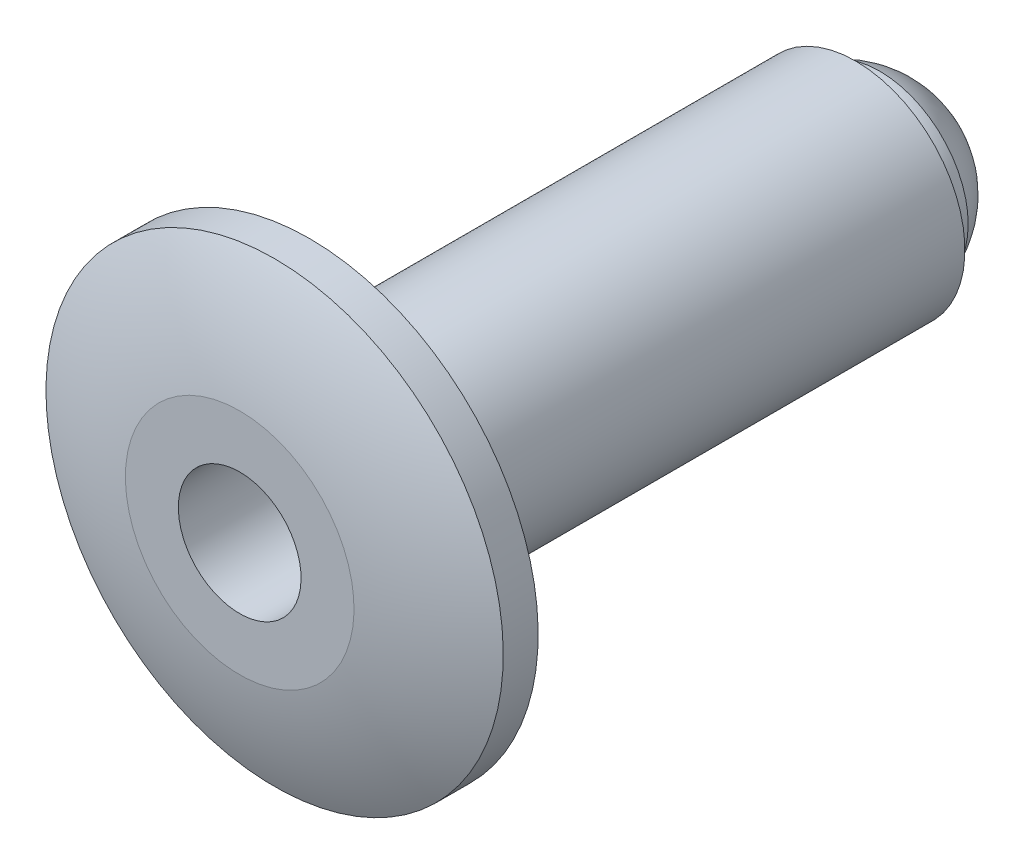
ISO-10303-21;
HEADER;
FILE_DESCRIPTION(('STEP AP214'),'2;1');
FILE_NAME('part.step','',(''),(''),'','','');
FILE_SCHEMA(('AUTOMOTIVE_DESIGN { 1 0 10303 214 1 1 1 1 }'));
ENDSEC;
DATA;
#1=APPLICATION_CONTEXT('core data for automotive mechanical design processes');
#2=APPLICATION_PROTOCOL_DEFINITION('international standard','automotive_design',2000,#1);
#3=PRODUCT_CONTEXT('',#1,'mechanical');
#4=PRODUCT('Part','Part','',(#3));
#5=PRODUCT_RELATED_PRODUCT_CATEGORY('part','',(#4));
#6=PRODUCT_DEFINITION_FORMATION('','',#4);
#7=PRODUCT_DEFINITION_CONTEXT('part definition',#1,'design');
#8=PRODUCT_DEFINITION('design','',#6,#7);
#9=PRODUCT_DEFINITION_SHAPE('','',#8);
#10=(LENGTH_UNIT() NAMED_UNIT(*) SI_UNIT(.MILLI.,.METRE.));
#11=(NAMED_UNIT(*) PLANE_ANGLE_UNIT() SI_UNIT($,.RADIAN.));
#12=(NAMED_UNIT(*) SI_UNIT($,.STERADIAN.) SOLID_ANGLE_UNIT());
#13=UNCERTAINTY_MEASURE_WITH_UNIT(LENGTH_MEASURE(1.E-05),#10,'distance_accuracy_value','');
#14=(GEOMETRIC_REPRESENTATION_CONTEXT(3) GLOBAL_UNCERTAINTY_ASSIGNED_CONTEXT((#13)) GLOBAL_UNIT_ASSIGNED_CONTEXT((#10,
#11,#12)) REPRESENTATION_CONTEXT('',''));
#15=CARTESIAN_POINT('',(0.,0.,0.));
#16=DIRECTION('',(0.,0.,1.));
#17=DIRECTION('',(1.,0.,0.));
#18=AXIS2_PLACEMENT_3D('',#15,#16,#17);
#19=CARTESIAN_POINT('',(0.,0.,-8.18303333333333));
#20=DIRECTION('',(0.,0.,1.));
#21=DIRECTION('',(0.,1.,0.));
#22=AXIS2_PLACEMENT_3D('',#19,#20,#21);
#23=SPHERICAL_SURFACE('',#22,1.29116666666667);
#24=CARTESIAN_POINT('',(0.,0.,-7.9502));
#25=DIRECTION('',(0.,0.,1.));
#26=DIRECTION('',(1.,0.,0.));
#27=AXIS2_PLACEMENT_3D('',#24,#25,#26);
#28=CIRCLE('',#27,1.27);
#29=CARTESIAN_POINT('',(0.,1.27,-7.9502));
#30=VERTEX_POINT('',#29);
#31=EDGE_CURVE('E11',#30,#30,#28,.T.);
#32=CARTESIAN_POINT('',(0.,0.,-8.29945));
#33=DIRECTION('',(0.,0.,1.));
#34=DIRECTION('',(1.,0.,0.));
#35=AXIS2_PLACEMENT_3D('',#32,#33,#34);
#36=CIRCLE('',#35,1.28590766419418);
#37=CARTESIAN_POINT('',(0.,1.28590766419418,-8.29945));
#38=VERTEX_POINT('',#37);
#39=EDGE_CURVE('E53',#38,#38,#36,.T.);
#40=CARTESIAN_POINT('',(0.,1.27,-7.9502));
#41=CARTESIAN_POINT('',(0.,1.27065874003626,-7.95379312524644));
#42=CARTESIAN_POINT('',(0.,1.27130223061609,-7.95738904622056));
#43=CARTESIAN_POINT('',(0.,1.27255866824084,-7.96458622026899));
#44=CARTESIAN_POINT('',(0.,1.27317161528576,-7.9681874733433));
#45=CARTESIAN_POINT('',(0.,1.27436692121863,-7.97539505223694));
#46=CARTESIAN_POINT('',(0.,1.27494928010658,-7.97900137805627));
#47=CARTESIAN_POINT('',(0.,1.27608336789665,-7.98621884261639));
#48=CARTESIAN_POINT('',(0.,1.27663509679877,-7.98982998135718));
#49=CARTESIAN_POINT('',(0.,1.2777078848369,-7.99705681161754));
#50=CARTESIAN_POINT('',(0.,1.27822894397292,-8.0006725031371));
#51=CARTESIAN_POINT('',(0.,1.27924035495041,-8.00790817847694));
#52=CARTESIAN_POINT('',(0.,1.27973070679188,-8.01152816229721));
#53=CARTESIAN_POINT('',(0.,1.28068066785264,-8.01877216145314));
#54=CARTESIAN_POINT('',(0.,1.28114027707193,-8.0223961767888));
#55=CARTESIAN_POINT('',(0.,1.28202871977847,-8.02964797789926));
#56=CARTESIAN_POINT('',(0.,1.28245755326571,-8.03327576367405));
#57=CARTESIAN_POINT('',(0.,1.28328441361456,-8.040534844315));
#58=CARTESIAN_POINT('',(0.,1.28368244047617,-8.04416613918116));
#59=CARTESIAN_POINT('',(0.,1.28444765889972,-8.05143197640426));
#60=CARTESIAN_POINT('',(0.,1.28481485046166,-8.0550665187612));
#61=CARTESIAN_POINT('',(0.,1.28551837183316,-8.06233858913133));
#62=CARTESIAN_POINT('',(0.,1.28585470164272,-8.06597611714453));
#63=CARTESIAN_POINT('',(0.,1.28649647528007,-8.07325389677754));
#64=CARTESIAN_POINT('',(0.,1.28680191910787,-8.07689414839736));
#65=CARTESIAN_POINT('',(0.,1.28738189877733,-8.08417711299781));
#66=CARTESIAN_POINT('',(0.,1.28765643461901,-8.08781982597843));
#67=CARTESIAN_POINT('',(0.,1.28817457853852,-8.09510745087732));
#68=CARTESIAN_POINT('',(0.,1.28841818661635,-8.0987523627956));
#69=CARTESIAN_POINT('',(0.,1.28887445745852,-8.10604412298823));
#70=CARTESIAN_POINT('',(0.,1.28908712022285,-8.1096909712626));
#71=CARTESIAN_POINT('',(0.,1.28948148511766,-8.11698634144635));
#72=CARTESIAN_POINT('',(0.,1.28966318724813,-8.12063486335575));
#73=CARTESIAN_POINT('',(0.,1.28999561778531,-8.12793331796795));
#74=CARTESIAN_POINT('',(0.,1.290146346192,-8.13158325067075));
#75=CARTESIAN_POINT('',(0.,1.29041681842305,-8.13888426392649));
#76=CARTESIAN_POINT('',(0.,1.2905365622474,-8.14253534447943));
#77=CARTESIAN_POINT('',(0.,1.29074505668735,-8.14983839040951));
#78=CARTESIAN_POINT('',(0.,1.29083380730295,-8.15349035578665));
#79=CARTESIAN_POINT('',(0.,1.29098030893174,-8.16079490827541));
#80=CARTESIAN_POINT('',(0.,1.29103805994494,-8.16444749538704));
#81=CARTESIAN_POINT('',(0.,1.29112255820851,-8.1717530282103));
#82=CARTESIAN_POINT('',(0.,1.29114930545889,-8.17540597392194));
#83=CARTESIAN_POINT('',(0.,1.29117179426993,-8.18271196078489));
#84=CARTESIAN_POINT('',(0.,1.29116753583061,-8.18636500193622));
#85=CARTESIAN_POINT('',(0.,1.29112801356902,-8.19367091651135));
#86=CARTESIAN_POINT('',(0.,1.29109274974676,-8.19732378993516));
#87=CARTESIAN_POINT('',(0.,1.29099121925976,-8.20462910590017));
#88=CARTESIAN_POINT('',(0.,1.29092495259502,-8.20828154844136));
#89=CARTESIAN_POINT('',(0.,1.29076142119688,-8.21558573951704));
#90=CARTESIAN_POINT('',(0.,1.29066415646348,-8.21923748805154));
#91=CARTESIAN_POINT('',(0.,1.29043863593523,-8.22654002803977));
#92=CARTESIAN_POINT('',(0.,1.29031038014037,-8.23019081949351));
#93=CARTESIAN_POINT('',(0.,1.29002288672816,-8.23749118231505));
#94=CARTESIAN_POINT('',(0.,1.28986364911081,-8.24114075368284));
#95=CARTESIAN_POINT('',(0.,1.28951420352761,-8.24843841341547));
#96=CARTESIAN_POINT('',(0.,1.28932399556175,-8.2520865017803));
#97=CARTESIAN_POINT('',(0.,1.2889126229752,-8.25938093269586));
#98=CARTESIAN_POINT('',(0.,1.28869145835449,-8.26302727524659));
#99=CARTESIAN_POINT('',(0.,1.28821818842482,-8.27031795185207));
#100=CARTESIAN_POINT('',(0.,1.28796608311586,-8.27396228590684));
#101=CARTESIAN_POINT('',(0.,1.28743094984543,-8.28124868297014));
#102=CARTESIAN_POINT('',(0.,1.28714792188397,-8.28489074597868));
#103=CARTESIAN_POINT('',(0.,1.2865509641685,-8.29217233861176));
#104=CARTESIAN_POINT('',(0.,1.28623703441449,-8.29581186823632));
#105=CARTESIAN_POINT('',(0.,1.28590766419418,-8.29945));
#106=B_SPLINE_CURVE_WITH_KNOTS('',3,(#40,#41,#42,#43,#44,#45,#46,#47,#48,#49,#50,#51,#52,#53,
#54,#55,#56,#57,#58,#59,#60,#61,#62,#63,#64,#65,#66,#67,#68,#69,#70,#71,#72,#73,#74,#75,#76,#77,
#78,#79,#80,#81,#82,#83,#84,#85,#86,#87,#88,#89,#90,#91,#92,#93,#94,#95,#96,#97,#98,#99,#100,
#101,#102,#103,#104,#105),.UNSPECIFIED.,.F.,.F.,(4,2,2,2,2,2,2,2,2,2,2,2,2,2,2,2,2,2,2,2,2,2,2,
2,2,2,2,2,2,2,2,2,4),(0.,0.0109589993165276,0.0219179986330523,0.0328769979495798,
0.043835997266105,0.0547949965826304,0.0657539958991574,0.0767129952156835,0.0876719945322099,
0.0986309938487347,0.109589993165262,0.120548992481788,0.131507991798313,0.14246699111484,
0.153425990431365,0.164384989747891,0.175343989064418,0.186302988380944,0.197261987697469,
0.208220987013996,0.219179986330521,0.230138985647048,0.241097984963574,0.252056984280101,
0.263015983596626,0.273974982913151,0.284933982229678,0.295892981546205,0.306851980862731,
0.317810980179255,0.328769979495782,0.339728978812308,0.350687978128835),.UNSPECIFIED.);
#107=EDGE_CURVE('BSEAM47',#30,#38,#106,.T.);
#108=ORIENTED_EDGE('',*,*,#31,.F.);
#109=ORIENTED_EDGE('',*,*,#39,.T.);
#110=ORIENTED_EDGE('',*,*,#107,.T.);
#111=ORIENTED_EDGE('',*,*,#107,.F.);
#112=EDGE_LOOP('',(#108,#110,#109,#111));
#113=FACE_BOUND('',#112,.T.);
#114=ADVANCED_FACE('F47',(#113),#23,.T.);
#115=CARTESIAN_POINT('',(0.,1.27,-7.9502));
#116=DIRECTION('',(0.,0.,-1.));
#117=DIRECTION('',(-1.,0.,0.));
#118=AXIS2_PLACEMENT_3D('',#115,#116,#117);
#119=PLANE('',#118);
#120=ORIENTED_EDGE('',*,*,#31,.T.);
#121=EDGE_LOOP('',(#120));
#122=FACE_BOUND('',#121,.T.);
#123=ADVANCED_FACE('F62',(#122),#119,.F.);
#124=CARTESIAN_POINT('',(0.,0.,-7.75498351449275));
#125=DIRECTION('',(0.,0.,1.));
#126=DIRECTION('',(0.,-1.,0.));
#127=AXIS2_PLACEMENT_3D('',#124,#125,#126);
#128=SPHERICAL_SURFACE('',#127,1.39642481884058);
#129=ORIENTED_EDGE('',*,*,#39,.F.);
#130=EDGE_LOOP('',(#129));
#131=FACE_BOUND('',#130,.T.);
#132=ADVANCED_FACE('F60',(#131),#128,.T.);
#133=CLOSED_SHELL('',(#114,#123,#132));
#134=MANIFOLD_SOLID_BREP('B2',#133);
#135=CARTESIAN_POINT('',(0.,1.5875,0.));
#136=DIRECTION('',(0.,0.,-1.));
#137=DIRECTION('',(0.,1.,0.));
#138=AXIS2_PLACEMENT_3D('',#135,#136,#137);
#139=PLANE('',#138);
#140=CARTESIAN_POINT('',(0.,0.,0.));
#141=DIRECTION('',(0.,0.,-1.));
#142=DIRECTION('',(0.,1.,0.));
#143=AXIS2_PLACEMENT_3D('',#140,#141,#142);
#144=CIRCLE('',#143,2.0356060253);
#145=CARTESIAN_POINT('',(0.,2.0356060253,0.));
#146=VERTEX_POINT('',#145);
#147=EDGE_CURVE('E114',#146,#146,#144,.F.);
#148=ORIENTED_EDGE('',*,*,#147,.F.);
#149=EDGE_LOOP('',(#148));
#150=FACE_BOUND('',#149,.T.);
#151=CARTESIAN_POINT('',(0.,0.,0.));
#152=DIRECTION('',(0.,0.,-1.));
#153=DIRECTION('',(0.,1.,0.));
#154=AXIS2_PLACEMENT_3D('',#151,#152,#153);
#155=CIRCLE('',#154,1.9075754838);
#156=CARTESIAN_POINT('',(0.,1.9075754838,0.));
#157=VERTEX_POINT('',#156);
#158=EDGE_CURVE('E46',#157,#157,#155,.T.);
#159=ORIENTED_EDGE('',*,*,#158,.F.);
#160=EDGE_LOOP('',(#159));
#161=FACE_BOUND('',#160,.T.);
#162=ADVANCED_FACE('F82',(#150,#161),#139,.T.);
#163=CARTESIAN_POINT('',(0.,0.,0.));
#164=DIRECTION('',(0.,0.,-1.));
#165=DIRECTION('',(0.,1.,0.));
#166=AXIS2_PLACEMENT_3D('',#163,#164,#165);
#167=CIRCLE('',#166,2.90227335597);
#168=CARTESIAN_POINT('',(0.,2.90227335597,0.));
#169=VERTEX_POINT('',#168);
#170=EDGE_CURVE('E93',#169,#169,#167,.F.);
#171=ORIENTED_EDGE('',*,*,#170,.F.);
#172=EDGE_LOOP('',(#171));
#173=FACE_BOUND('',#172,.T.);
#174=CARTESIAN_POINT('',(0.,0.,0.));
#175=DIRECTION('',(0.,0.,-1.));
#176=DIRECTION('',(0.,1.,0.));
#177=AXIS2_PLACEMENT_3D('',#174,#175,#176);
#178=CIRCLE('',#177,2.6494949423);
#179=CARTESIAN_POINT('',(0.,2.6494949423,0.));
#180=VERTEX_POINT('',#179);
#181=EDGE_CURVE('E105',#180,#180,#178,.T.);
#182=ORIENTED_EDGE('',*,*,#181,.F.);
#183=EDGE_LOOP('',(#182));
#184=FACE_BOUND('',#183,.T.);
#185=ADVANCED_FACE('F190',(#173,#184),#139,.T.);
#186=CARTESIAN_POINT('',(0.,0.,0.));
#187=DIRECTION('',(0.,0.,-1.));
#188=DIRECTION('',(0.,1.,0.));
#189=AXIS2_PLACEMENT_3D('',#186,#187,#188);
#190=CIRCLE('',#189,2.5510096427);
#191=CARTESIAN_POINT('',(0.,2.5510096427,0.));
#192=VERTEX_POINT('',#191);
#193=EDGE_CURVE('E102',#192,#192,#190,.F.);
#194=ORIENTED_EDGE('',*,*,#193,.F.);
#195=EDGE_LOOP('',(#194));
#196=FACE_BOUND('',#195,.T.);
#197=CARTESIAN_POINT('',(0.,0.,0.));
#198=DIRECTION('',(0.,0.,-1.));
#199=DIRECTION('',(0.,1.,0.));
#200=AXIS2_PLACEMENT_3D('',#197,#198,#199);
#201=CIRCLE('',#200,2.40656627652);
#202=CARTESIAN_POINT('',(0.,2.40656627652,0.));
#203=VERTEX_POINT('',#202);
#204=EDGE_CURVE('E111',#203,#203,#201,.T.);
#205=ORIENTED_EDGE('',*,*,#204,.F.);
#206=EDGE_LOOP('',(#205));
#207=FACE_BOUND('',#206,.T.);
#208=ADVANCED_FACE('F199',(#196,#207),#139,.T.);
#209=CARTESIAN_POINT('',(0.,0.,0.));
#210=DIRECTION('',(0.,0.,-1.));
#211=DIRECTION('',(0.,1.,0.));
#212=AXIS2_PLACEMENT_3D('',#209,#210,#211);
#213=CIRCLE('',#212,2.30808097692);
#214=CARTESIAN_POINT('',(0.,2.30808097692,0.));
#215=VERTEX_POINT('',#214);
#216=EDGE_CURVE('E108',#215,#215,#213,.F.);
#217=ORIENTED_EDGE('',*,*,#216,.F.);
#218=EDGE_LOOP('',(#217));
#219=FACE_BOUND('',#218,.T.);
#220=CARTESIAN_POINT('',(0.,0.,0.));
#221=DIRECTION('',(0.,0.,-1.));
#222=DIRECTION('',(0.,1.,0.));
#223=AXIS2_PLACEMENT_3D('',#220,#221,#222);
#224=CIRCLE('',#223,2.1340913249);
#225=CARTESIAN_POINT('',(0.,2.1340913249,0.));
#226=VERTEX_POINT('',#225);
#227=EDGE_CURVE('E117',#226,#226,#224,.T.);
#228=ORIENTED_EDGE('',*,*,#227,.F.);
#229=EDGE_LOOP('',(#228));
#230=FACE_BOUND('',#229,.T.);
#231=ADVANCED_FACE('F208',(#219,#230),#139,.T.);
#232=CARTESIAN_POINT('',(0.,0.,12.9413));
#233=DIRECTION('',(0.,0.,1.));
#234=DIRECTION('',(1.,0.,0.));
#235=AXIS2_PLACEMENT_3D('',#232,#233,#234);
#236=CYLINDRICAL_SURFACE('',#235,2.0356060253);
#237=ORIENTED_EDGE('',*,*,#147,.T.);
#238=EDGE_LOOP('',(#237));
#239=FACE_BOUND('',#238,.T.);
#240=CARTESIAN_POINT('',(0.,0.,-0.0254000000000018));
#241=DIRECTION('',(0.,0.,1.));
#242=DIRECTION('',(1.,0.,0.));
#243=AXIS2_PLACEMENT_3D('',#240,#241,#242);
#244=CIRCLE('',#243,2.0356060253);
#245=CARTESIAN_POINT('',(2.0356060253,0.,-0.0254000000000018));
#246=VERTEX_POINT('',#245);
#247=EDGE_CURVE('E141',#246,#246,#244,.T.);
#248=ORIENTED_EDGE('',*,*,#247,.F.);
#249=EDGE_LOOP('',(#248));
#250=FACE_BOUND('',#249,.T.);
#251=ADVANCED_FACE('F221',(#239,#250),#236,.F.);
#252=CARTESIAN_POINT('',(2.0356060253,0.,-0.0254000000000017));
#253=DIRECTION('',(0.,0.,-1.));
#254=DIRECTION('',(-1.,0.,0.));
#255=AXIS2_PLACEMENT_3D('',#252,#253,#254);
#256=PLANE('',#255);
#257=ORIENTED_EDGE('',*,*,#247,.T.);
#258=EDGE_LOOP('',(#257));
#259=FACE_BOUND('',#258,.T.);
#260=CARTESIAN_POINT('',(0.,0.,-0.0254000000000018));
#261=DIRECTION('',(0.,0.,1.));
#262=DIRECTION('',(1.,0.,0.));
#263=AXIS2_PLACEMENT_3D('',#260,#261,#262);
#264=CIRCLE('',#263,2.1340913249);
#265=CARTESIAN_POINT('',(2.1340913249,0.,-0.0254000000000018));
#266=VERTEX_POINT('',#265);
#267=EDGE_CURVE('E144',#266,#266,#264,.T.);
#268=ORIENTED_EDGE('',*,*,#267,.F.);
#269=EDGE_LOOP('',(#268));
#270=FACE_BOUND('',#269,.T.);
#271=ADVANCED_FACE('F227',(#259,#270),#256,.T.);
#272=CARTESIAN_POINT('',(0.,0.,12.9413));
#273=DIRECTION('',(0.,0.,1.));
#274=DIRECTION('',(1.,0.,0.));
#275=AXIS2_PLACEMENT_3D('',#272,#273,#274);
#276=CYLINDRICAL_SURFACE('',#275,2.1340913249);
#277=ORIENTED_EDGE('',*,*,#267,.T.);
#278=EDGE_LOOP('',(#277));
#279=FACE_BOUND('',#278,.T.);
#280=ORIENTED_EDGE('',*,*,#227,.T.);
#281=EDGE_LOOP('',(#280));
#282=FACE_BOUND('',#281,.T.);
#283=ADVANCED_FACE('F234',(#279,#282),#276,.T.);
#284=CARTESIAN_POINT('',(0.,0.,12.9413));
#285=DIRECTION('',(0.,0.,1.));
#286=DIRECTION('',(1.,0.,0.));
#287=AXIS2_PLACEMENT_3D('',#284,#285,#286);
#288=CYLINDRICAL_SURFACE('',#287,2.30808097692);
#289=ORIENTED_EDGE('',*,*,#216,.T.);
#290=EDGE_LOOP('',(#289));
#291=FACE_BOUND('',#290,.T.);
#292=CARTESIAN_POINT('',(0.,0.,-0.0254000000000018));
#293=DIRECTION('',(0.,0.,1.));
#294=DIRECTION('',(1.,0.,0.));
#295=AXIS2_PLACEMENT_3D('',#292,#293,#294);
#296=CIRCLE('',#295,2.30808097692);
#297=CARTESIAN_POINT('',(2.30808097692,0.,-0.0254000000000018));
#298=VERTEX_POINT('',#297);
#299=EDGE_CURVE('E147',#298,#298,#296,.T.);
#300=ORIENTED_EDGE('',*,*,#299,.F.);
#301=EDGE_LOOP('',(#300));
#302=FACE_BOUND('',#301,.T.);
#303=ADVANCED_FACE('F236',(#291,#302),#288,.F.);
#304=CARTESIAN_POINT('',(2.30808097692,0.,-0.0254000000000017));
#305=DIRECTION('',(0.,0.,-1.));
#306=DIRECTION('',(-1.,0.,0.));
#307=AXIS2_PLACEMENT_3D('',#304,#305,#306);
#308=PLANE('',#307);
#309=ORIENTED_EDGE('',*,*,#299,.T.);
#310=EDGE_LOOP('',(#309));
#311=FACE_BOUND('',#310,.T.);
#312=CARTESIAN_POINT('',(0.,0.,-0.0254000000000018));
#313=DIRECTION('',(0.,0.,1.));
#314=DIRECTION('',(1.,0.,0.));
#315=AXIS2_PLACEMENT_3D('',#312,#313,#314);
#316=CIRCLE('',#315,2.40656627652);
#317=CARTESIAN_POINT('',(2.40656627652,0.,-0.0254000000000018));
#318=VERTEX_POINT('',#317);
#319=EDGE_CURVE('E150',#318,#318,#316,.T.);
#320=ORIENTED_EDGE('',*,*,#319,.F.);
#321=EDGE_LOOP('',(#320));
#322=FACE_BOUND('',#321,.T.);
#323=ADVANCED_FACE('F243',(#311,#322),#308,.T.);
#324=CARTESIAN_POINT('',(0.,0.,12.9413));
#325=DIRECTION('',(0.,0.,1.));
#326=DIRECTION('',(1.,0.,0.));
#327=AXIS2_PLACEMENT_3D('',#324,#325,#326);
#328=CYLINDRICAL_SURFACE('',#327,2.40656627652);
#329=ORIENTED_EDGE('',*,*,#319,.T.);
#330=EDGE_LOOP('',(#329));
#331=FACE_BOUND('',#330,.T.);
#332=ORIENTED_EDGE('',*,*,#204,.T.);
#333=EDGE_LOOP('',(#332));
#334=FACE_BOUND('',#333,.T.);
#335=ADVANCED_FACE('F251',(#331,#334),#328,.T.);
#336=CARTESIAN_POINT('',(0.,0.,12.9413));
#337=DIRECTION('',(0.,0.,1.));
#338=DIRECTION('',(1.,0.,0.));
#339=AXIS2_PLACEMENT_3D('',#336,#337,#338);
#340=CYLINDRICAL_SURFACE('',#339,2.5510096427);
#341=ORIENTED_EDGE('',*,*,#193,.T.);
#342=EDGE_LOOP('',(#341));
#343=FACE_BOUND('',#342,.T.);
#344=CARTESIAN_POINT('',(0.,0.,-0.0254000000000018));
#345=DIRECTION('',(0.,0.,1.));
#346=DIRECTION('',(1.,0.,0.));
#347=AXIS2_PLACEMENT_3D('',#344,#345,#346);
#348=CIRCLE('',#347,2.5510096427);
#349=CARTESIAN_POINT('',(2.5510096427,0.,-0.0254000000000018));
#350=VERTEX_POINT('',#349);
#351=EDGE_CURVE('E153',#350,#350,#348,.T.);
#352=ORIENTED_EDGE('',*,*,#351,.F.);
#353=EDGE_LOOP('',(#352));
#354=FACE_BOUND('',#353,.T.);
#355=ADVANCED_FACE('F255',(#343,#354),#340,.F.);
#356=CARTESIAN_POINT('',(2.5510096427,0.,-0.0254000000000017));
#357=DIRECTION('',(0.,0.,-1.));
#358=DIRECTION('',(-1.,0.,0.));
#359=AXIS2_PLACEMENT_3D('',#356,#357,#358);
#360=PLANE('',#359);
#361=ORIENTED_EDGE('',*,*,#351,.T.);
#362=EDGE_LOOP('',(#361));
#363=FACE_BOUND('',#362,.T.);
#364=CARTESIAN_POINT('',(0.,0.,-0.0254000000000018));
#365=DIRECTION('',(0.,0.,1.));
#366=DIRECTION('',(1.,0.,0.));
#367=AXIS2_PLACEMENT_3D('',#364,#365,#366);
#368=CIRCLE('',#367,2.6494949423);
#369=CARTESIAN_POINT('',(2.6494949423,0.,-0.0254000000000018));
#370=VERTEX_POINT('',#369);
#371=EDGE_CURVE('E156',#370,#370,#368,.T.);
#372=ORIENTED_EDGE('',*,*,#371,.F.);
#373=EDGE_LOOP('',(#372));
#374=FACE_BOUND('',#373,.T.);
#375=ADVANCED_FACE('F259',(#363,#374),#360,.T.);
#376=CARTESIAN_POINT('',(0.,0.,12.9413));
#377=DIRECTION('',(0.,0.,1.));
#378=DIRECTION('',(1.,0.,0.));
#379=AXIS2_PLACEMENT_3D('',#376,#377,#378);
#380=CYLINDRICAL_SURFACE('',#379,2.6494949423);
#381=ORIENTED_EDGE('',*,*,#371,.T.);
#382=EDGE_LOOP('',(#381));
#383=FACE_BOUND('',#382,.T.);
#384=ORIENTED_EDGE('',*,*,#181,.T.);
#385=EDGE_LOOP('',(#384));
#386=FACE_BOUND('',#385,.T.);
#387=ADVANCED_FACE('F263',(#383,#386),#380,.T.);
#388=CARTESIAN_POINT('',(0.,0.,12.9413));
#389=DIRECTION('',(0.,0.,1.));
#390=DIRECTION('',(1.,0.,0.));
#391=AXIS2_PLACEMENT_3D('',#388,#389,#390);
#392=CYLINDRICAL_SURFACE('',#391,2.90227335597);
#393=ORIENTED_EDGE('',*,*,#170,.T.);
#394=EDGE_LOOP('',(#393));
#395=FACE_BOUND('',#394,.T.);
#396=CARTESIAN_POINT('',(0.,0.,-0.0254000000000018));
#397=DIRECTION('',(0.,0.,1.));
#398=DIRECTION('',(1.,0.,0.));
#399=AXIS2_PLACEMENT_3D('',#396,#397,#398);
#400=CIRCLE('',#399,2.90227335597);
#401=CARTESIAN_POINT('',(2.90227335597,0.,-0.0254000000000018));
#402=VERTEX_POINT('',#401);
#403=EDGE_CURVE('E159',#402,#402,#400,.T.);
#404=ORIENTED_EDGE('',*,*,#403,.F.);
#405=EDGE_LOOP('',(#404));
#406=FACE_BOUND('',#405,.T.);
#407=ADVANCED_FACE('F267',(#395,#406),#392,.F.);
#408=CARTESIAN_POINT('',(2.90227335597,0.,-0.0254000000000017));
#409=DIRECTION('',(0.,0.,-1.));
#410=DIRECTION('',(-1.,0.,0.));
#411=AXIS2_PLACEMENT_3D('',#408,#409,#410);
#412=PLANE('',#411);
#413=ORIENTED_EDGE('',*,*,#403,.T.);
#414=EDGE_LOOP('',(#413));
#415=FACE_BOUND('',#414,.T.);
#416=CARTESIAN_POINT('',(0.,0.,-0.0254000000000018));
#417=DIRECTION('',(0.,0.,1.));
#418=DIRECTION('',(1.,0.,0.));
#419=AXIS2_PLACEMENT_3D('',#416,#417,#418);
#420=CIRCLE('',#419,3.00075865557);
#421=CARTESIAN_POINT('',(3.00075865557,0.,-0.0254000000000018));
#422=VERTEX_POINT('',#421);
#423=EDGE_CURVE('E162',#422,#422,#420,.T.);
#424=ORIENTED_EDGE('',*,*,#423,.F.);
#425=EDGE_LOOP('',(#424));
#426=FACE_BOUND('',#425,.T.);
#427=ADVANCED_FACE('F271',(#415,#426),#412,.T.);
#428=CARTESIAN_POINT('',(0.,0.,12.9413));
#429=DIRECTION('',(0.,0.,1.));
#430=DIRECTION('',(1.,0.,0.));
#431=AXIS2_PLACEMENT_3D('',#428,#429,#430);
#432=CYLINDRICAL_SURFACE('',#431,3.00075865557);
#433=ORIENTED_EDGE('',*,*,#423,.T.);
#434=EDGE_LOOP('',(#433));
#435=FACE_BOUND('',#434,.T.);
#436=CARTESIAN_POINT('',(0.,0.,0.));
#437=DIRECTION('',(0.,0.,-1.));
#438=DIRECTION('',(0.,1.,0.));
#439=AXIS2_PLACEMENT_3D('',#436,#437,#438);
#440=CIRCLE('',#439,3.00075865557);
#441=CARTESIAN_POINT('',(0.,3.00075865557,0.));
#442=VERTEX_POINT('',#441);
#443=EDGE_CURVE('E97',#442,#442,#440,.T.);
#444=ORIENTED_EDGE('',*,*,#443,.T.);
#445=EDGE_LOOP('',(#444));
#446=FACE_BOUND('',#445,.T.);
#447=ADVANCED_FACE('F275',(#435,#446),#432,.T.);
#448=CARTESIAN_POINT('',(0.,0.89296875,-0.795020000000002));
#449=DIRECTION('',(0.,0.,1.));
#450=DIRECTION('',(0.,-1.,0.));
#451=AXIS2_PLACEMENT_3D('',#448,#449,#450);
#452=PLANE('',#451);
#453=CARTESIAN_POINT('',(0.,0.,-0.795020000000001));
#454=DIRECTION('',(0.,0.,-1.));
#455=DIRECTION('',(0.,1.,0.));
#456=AXIS2_PLACEMENT_3D('',#453,#454,#455);
#457=CIRCLE('',#456,0.892968750000001);
#458=CARTESIAN_POINT('',(0.,0.89296875,-0.795020000000001));
#459=VERTEX_POINT('',#458);
#460=EDGE_CURVE('E129',#459,#459,#457,.T.);
#461=ORIENTED_EDGE('',*,*,#460,.F.);
#462=EDGE_LOOP('',(#461));
#463=FACE_BOUND('',#462,.T.);
#464=ADVANCED_FACE('F277',(#463),#452,.T.);
#465=CARTESIAN_POINT('',(0.,0.,-7.9502));
#466=DIRECTION('',(0.,0.,-1.));
#467=DIRECTION('',(0.,1.,0.));
#468=AXIS2_PLACEMENT_3D('',#465,#466,#467);
#469=CYLINDRICAL_SURFACE('',#468,0.892968750000001);
#470=ORIENTED_EDGE('',*,*,#460,.T.);
#471=EDGE_LOOP('',(#470));
#472=FACE_BOUND('',#471,.T.);
#473=CARTESIAN_POINT('',(0.,0.,1.016));
#474=DIRECTION('',(0.,0.,-1.));
#475=DIRECTION('',(0.,1.,0.));
#476=AXIS2_PLACEMENT_3D('',#473,#474,#475);
#477=CIRCLE('',#476,0.892968750000001);
#478=CARTESIAN_POINT('',(0.,0.89296875,1.016));
#479=VERTEX_POINT('',#478);
#480=EDGE_CURVE('E126',#479,#479,#477,.T.);
#481=ORIENTED_EDGE('',*,*,#480,.F.);
#482=EDGE_LOOP('',(#481));
#483=FACE_BOUND('',#482,.T.);
#484=ADVANCED_FACE('F282',(#472,#483),#469,.F.);
#485=CARTESIAN_POINT('',(0.,0.89296875,1.016));
#486=DIRECTION('',(0.,0.,1.));
#487=DIRECTION('',(0.,-1.,0.));
#488=AXIS2_PLACEMENT_3D('',#485,#486,#487);
#489=PLANE('',#488);
#490=ORIENTED_EDGE('',*,*,#480,.T.);
#491=EDGE_LOOP('',(#490));
#492=FACE_BOUND('',#491,.T.);
#493=CARTESIAN_POINT('',(0.,0.,1.016));
#494=DIRECTION('',(0.,0.,-1.));
#495=DIRECTION('',(0.,1.,0.));
#496=AXIS2_PLACEMENT_3D('',#493,#494,#495);
#497=CIRCLE('',#496,1.6637);
#498=CARTESIAN_POINT('',(0.,1.6637,1.016));
#499=VERTEX_POINT('',#498);
#500=EDGE_CURVE('E123',#499,#499,#497,.T.);
#501=ORIENTED_EDGE('',*,*,#500,.F.);
#502=EDGE_LOOP('',(#501));
#503=FACE_BOUND('',#502,.T.);
#504=ADVANCED_FACE('F293',(#492,#503),#489,.T.);
#505=CARTESIAN_POINT('',(0.,0.,-4.81139499999999));
#506=DIRECTION('',(0.,0.,-1.));
#507=DIRECTION('',(0.,1.,0.));
#508=AXIS2_PLACEMENT_3D('',#505,#506,#507);
#509=DEGENERATE_TOROIDAL_SURFACE('',#508,0.79375,5.89197297079042,.T.);
#510=ORIENTED_EDGE('',*,*,#500,.T.);
#511=EDGE_LOOP('',(#510));
#512=FACE_BOUND('',#511,.T.);
#513=CARTESIAN_POINT('',(0.,0.,0.507999999999998));
#514=DIRECTION('',(0.,0.,-1.));
#515=DIRECTION('',(0.,1.,0.));
#516=AXIS2_PLACEMENT_3D('',#513,#514,#515);
#517=CIRCLE('',#516,3.3274);
#518=CARTESIAN_POINT('',(0.,3.3274,0.507999999999998));
#519=VERTEX_POINT('',#518);
#520=EDGE_CURVE('E120',#519,#519,#517,.T.);
#521=ORIENTED_EDGE('',*,*,#520,.F.);
#522=EDGE_LOOP('',(#521));
#523=FACE_BOUND('',#522,.T.);
#524=ADVANCED_FACE('F216',(#512,#523),#509,.T.);
#525=CARTESIAN_POINT('',(0.,0.,-7.9502));
#526=DIRECTION('',(0.,0.,-1.));
#527=DIRECTION('',(0.,1.,0.));
#528=AXIS2_PLACEMENT_3D('',#525,#526,#527);
#529=CYLINDRICAL_SURFACE('',#528,3.3274);
#530=ORIENTED_EDGE('',*,*,#520,.T.);
#531=EDGE_LOOP('',(#530));
#532=FACE_BOUND('',#531,.T.);
#533=CARTESIAN_POINT('',(0.,0.,0.));
#534=DIRECTION('',(0.,0.,-1.));
#535=DIRECTION('',(0.,1.,0.));
#536=AXIS2_PLACEMENT_3D('',#533,#534,#535);
#537=CIRCLE('',#536,3.3274);
#538=CARTESIAN_POINT('',(0.,3.3274,0.));
#539=VERTEX_POINT('',#538);
#540=EDGE_CURVE('E138',#539,#539,#537,.T.);
#541=ORIENTED_EDGE('',*,*,#540,.F.);
#542=EDGE_LOOP('',(#541));
#543=FACE_BOUND('',#542,.T.);
#544=ADVANCED_FACE('F84',(#532,#543),#529,.T.);
#545=ORIENTED_EDGE('',*,*,#443,.F.);
#546=EDGE_LOOP('',(#545));
#547=FACE_BOUND('',#546,.T.);
#548=ORIENTED_EDGE('',*,*,#540,.T.);
#549=EDGE_LOOP('',(#548));
#550=FACE_BOUND('',#549,.T.);
#551=ADVANCED_FACE('F194',(#547,#550),#139,.T.);
#552=CARTESIAN_POINT('',(0.,0.,12.9413));
#553=DIRECTION('',(0.,0.,1.));
#554=DIRECTION('',(1.,0.,0.));
#555=AXIS2_PLACEMENT_3D('',#552,#553,#554);
#556=CYLINDRICAL_SURFACE('',#555,1.9075754838);
#557=CARTESIAN_POINT('',(0.,0.,-0.0254000000000018));
#558=DIRECTION('',(0.,0.,1.));
#559=DIRECTION('',(1.,0.,0.));
#560=AXIS2_PLACEMENT_3D('',#557,#558,#559);
#561=CIRCLE('',#560,1.9075754838);
#562=CARTESIAN_POINT('',(1.9075754838,0.,-0.0254000000000018));
#563=VERTEX_POINT('',#562);
#564=EDGE_CURVE('E165',#563,#563,#561,.T.);
#565=ORIENTED_EDGE('',*,*,#564,.T.);
#566=EDGE_LOOP('',(#565));
#567=FACE_BOUND('',#566,.T.);
#568=ORIENTED_EDGE('',*,*,#158,.T.);
#569=EDGE_LOOP('',(#568));
#570=FACE_BOUND('',#569,.T.);
#571=ADVANCED_FACE('F187',(#567,#570),#556,.T.);
#572=CARTESIAN_POINT('',(1.9075754838,0.,-0.0254000000000022));
#573=DIRECTION('',(0.,0.,-1.));
#574=DIRECTION('',(-1.,0.,0.));
#575=AXIS2_PLACEMENT_3D('',#572,#573,#574);
#576=PLANE('',#575);
#577=CARTESIAN_POINT('',(0.,0.,-0.0254000000000018));
#578=DIRECTION('',(0.,0.,1.));
#579=DIRECTION('',(1.,0.,0.));
#580=AXIS2_PLACEMENT_3D('',#577,#578,#579);
#581=CIRCLE('',#580,1.8090901842);
#582=CARTESIAN_POINT('',(1.8090901842,0.,-0.0254000000000018));
#583=VERTEX_POINT('',#582);
#584=EDGE_CURVE('E168',#583,#583,#581,.T.);
#585=ORIENTED_EDGE('',*,*,#584,.T.);
#586=EDGE_LOOP('',(#585));
#587=FACE_BOUND('',#586,.T.);
#588=ORIENTED_EDGE('',*,*,#564,.F.);
#589=EDGE_LOOP('',(#588));
#590=FACE_BOUND('',#589,.T.);
#591=ADVANCED_FACE('F172',(#587,#590),#576,.T.);
#592=CARTESIAN_POINT('',(0.,0.,12.9413));
#593=DIRECTION('',(0.,0.,1.));
#594=DIRECTION('',(1.,0.,0.));
#595=AXIS2_PLACEMENT_3D('',#592,#593,#594);
#596=CYLINDRICAL_SURFACE('',#595,1.8090901842);
#597=CARTESIAN_POINT('',(0.,0.,0.));
#598=DIRECTION('',(0.,0.,-1.));
#599=DIRECTION('',(0.,1.,0.));
#600=AXIS2_PLACEMENT_3D('',#597,#598,#599);
#601=CIRCLE('',#600,1.8090901842);
#602=CARTESIAN_POINT('',(0.,1.8090901842,0.));
#603=VERTEX_POINT('',#602);
#604=EDGE_CURVE('E89',#603,#603,#601,.F.);
#605=ORIENTED_EDGE('',*,*,#604,.T.);
#606=EDGE_LOOP('',(#605));
#607=FACE_BOUND('',#606,.T.);
#608=ORIENTED_EDGE('',*,*,#584,.F.);
#609=EDGE_LOOP('',(#608));
#610=FACE_BOUND('',#609,.T.);
#611=ADVANCED_FACE('F175',(#607,#610),#596,.F.);
#612=CARTESIAN_POINT('',(0.,1.5875,-7.9502));
#613=DIRECTION('',(0.,0.,-1.));
#614=DIRECTION('',(0.,1.,0.));
#615=AXIS2_PLACEMENT_3D('',#612,#613,#614);
#616=PLANE('',#615);
#617=CARTESIAN_POINT('',(0.,0.,-7.9502));
#618=DIRECTION('',(0.,0.,-1.));
#619=DIRECTION('',(0.,1.,0.));
#620=AXIS2_PLACEMENT_3D('',#617,#618,#619);
#621=CIRCLE('',#620,1.5875);
#622=CARTESIAN_POINT('',(0.,1.5875,-7.9502));
#623=VERTEX_POINT('',#622);
#624=EDGE_CURVE('E132',#623,#623,#621,.T.);
#625=ORIENTED_EDGE('',*,*,#624,.T.);
#626=EDGE_LOOP('',(#625));
#627=FACE_BOUND('',#626,.T.);
#628=ADVANCED_FACE('F177',(#627),#616,.T.);
#629=CARTESIAN_POINT('',(0.,0.,-7.9502));
#630=DIRECTION('',(0.,0.,-1.));
#631=DIRECTION('',(0.,1.,0.));
#632=AXIS2_PLACEMENT_3D('',#629,#630,#631);
#633=CYLINDRICAL_SURFACE('',#632,1.5875);
#634=CARTESIAN_POINT('',(0.,0.,0.));
#635=DIRECTION('',(0.,0.,-1.));
#636=DIRECTION('',(0.,1.,0.));
#637=AXIS2_PLACEMENT_3D('',#634,#635,#636);
#638=CIRCLE('',#637,1.5875);
#639=CARTESIAN_POINT('',(0.,1.5875,0.));
#640=VERTEX_POINT('',#639);
#641=EDGE_CURVE('E135',#640,#640,#638,.T.);
#642=ORIENTED_EDGE('',*,*,#641,.T.);
#643=EDGE_LOOP('',(#642));
#644=FACE_BOUND('',#643,.T.);
#645=ORIENTED_EDGE('',*,*,#624,.F.);
#646=EDGE_LOOP('',(#645));
#647=FACE_BOUND('',#646,.T.);
#648=ADVANCED_FACE('F184',(#644,#647),#633,.T.);
#649=ORIENTED_EDGE('',*,*,#641,.F.);
#650=EDGE_LOOP('',(#649));
#651=FACE_BOUND('',#650,.T.);
#652=ORIENTED_EDGE('',*,*,#604,.F.);
#653=EDGE_LOOP('',(#652));
#654=FACE_BOUND('',#653,.T.);
#655=ADVANCED_FACE('F193',(#651,#654),#139,.T.);
#656=CLOSED_SHELL('',(#162,#185,#208,#231,#251,#271,#283,#303,#323,#335,#355,#375,#387,#407,
#427,#447,#464,#484,#504,#524,#544,#551,#571,#591,#611,#628,#648,#655));
#657=MANIFOLD_SOLID_BREP('B6',#656);
#658=ADVANCED_BREP_SHAPE_REPRESENTATION('',(#18,#134,#657),#14);
#659=SHAPE_DEFINITION_REPRESENTATION(#9,#658);
ENDSEC;
END-ISO-10303-21;
